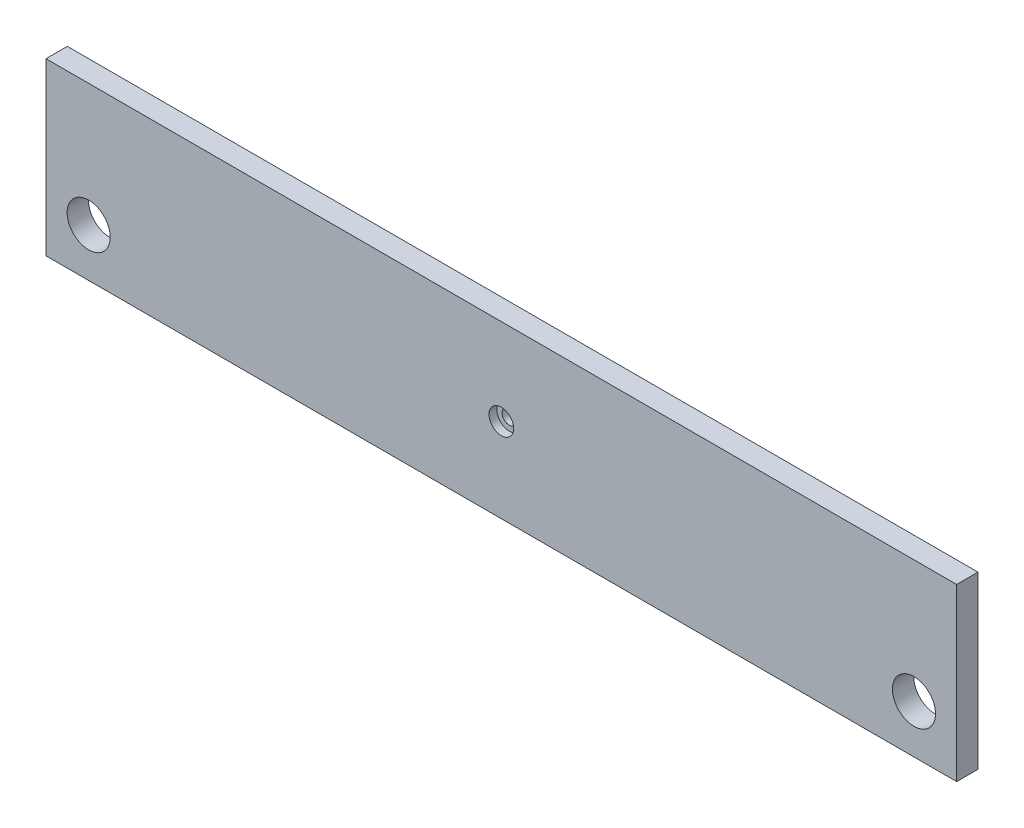
ISO-10303-21;
HEADER;
FILE_DESCRIPTION(('STEP AP214'),'2;1');
FILE_NAME('part.step','',(''),(''),'','','');
FILE_SCHEMA(('AUTOMOTIVE_DESIGN { 1 0 10303 214 1 1 1 1 }'));
ENDSEC;
DATA;
#1=APPLICATION_CONTEXT('core data for automotive mechanical design processes');
#2=APPLICATION_PROTOCOL_DEFINITION('international standard','automotive_design',2000,#1);
#3=PRODUCT_CONTEXT('',#1,'mechanical');
#4=PRODUCT('Part','Part','',(#3));
#5=PRODUCT_RELATED_PRODUCT_CATEGORY('part','',(#4));
#6=PRODUCT_DEFINITION_FORMATION('','',#4);
#7=PRODUCT_DEFINITION_CONTEXT('part definition',#1,'design');
#8=PRODUCT_DEFINITION('design','',#6,#7);
#9=PRODUCT_DEFINITION_SHAPE('','',#8);
#10=(LENGTH_UNIT() NAMED_UNIT(*) SI_UNIT(.MILLI.,.METRE.));
#11=(NAMED_UNIT(*) PLANE_ANGLE_UNIT() SI_UNIT($,.RADIAN.));
#12=(NAMED_UNIT(*) SI_UNIT($,.STERADIAN.) SOLID_ANGLE_UNIT());
#13=UNCERTAINTY_MEASURE_WITH_UNIT(LENGTH_MEASURE(1.E-05),#10,'distance_accuracy_value','');
#14=(GEOMETRIC_REPRESENTATION_CONTEXT(3) GLOBAL_UNCERTAINTY_ASSIGNED_CONTEXT((#13)) GLOBAL_UNIT_ASSIGNED_CONTEXT((#10,
#11,#12)) REPRESENTATION_CONTEXT('',''));
#15=CARTESIAN_POINT('',(0.,0.,0.));
#16=DIRECTION('',(0.,0.,1.));
#17=DIRECTION('',(1.,0.,0.));
#18=AXIS2_PLACEMENT_3D('',#15,#16,#17);
#19=CARTESIAN_POINT('',(0.,0.,19.05));
#20=DIRECTION('',(1.,0.,0.));
#21=DIRECTION('',(0.,0.,-1.));
#22=AXIS2_PLACEMENT_3D('',#19,#20,#21);
#23=PLANE('',#22);
#24=DIRECTION('',(0.,-1.,0.));
#25=VECTOR('',#24,1.);
#26=CARTESIAN_POINT('',(0.,0.,0.));
#27=LINE('',#26,#25);
#28=CARTESIAN_POINT('',(0.,152.4,0.));
#29=VERTEX_POINT('',#28);
#30=CARTESIAN_POINT('',(0.,0.,0.));
#31=VERTEX_POINT('',#30);
#32=EDGE_CURVE('E95',#29,#31,#27,.T.);
#33=ORIENTED_EDGE('',*,*,#32,.T.);
#34=DIRECTION('',(0.,0.,-1.));
#35=VECTOR('',#34,1.);
#36=CARTESIAN_POINT('',(0.,0.,19.05));
#37=LINE('',#36,#35);
#38=CARTESIAN_POINT('',(0.,0.,19.05));
#39=VERTEX_POINT('',#38);
#40=EDGE_CURVE('E11',#39,#31,#37,.T.);
#41=ORIENTED_EDGE('',*,*,#40,.F.);
#42=DIRECTION('',(0.,-1.,0.));
#43=VECTOR('',#42,1.);
#44=CARTESIAN_POINT('',(0.,0.,19.05));
#45=LINE('',#44,#43);
#46=CARTESIAN_POINT('',(0.,152.4,19.05));
#47=VERTEX_POINT('',#46);
#48=EDGE_CURVE('E83',#47,#39,#45,.T.);
#49=ORIENTED_EDGE('',*,*,#48,.F.);
#50=DIRECTION('',(0.,0.,-1.));
#51=VECTOR('',#50,1.);
#52=CARTESIAN_POINT('',(0.,152.4,19.05));
#53=LINE('',#52,#51);
#54=EDGE_CURVE('E91',#47,#29,#53,.T.);
#55=ORIENTED_EDGE('',*,*,#54,.T.);
#56=EDGE_LOOP('',(#33,#41,#49,#55));
#57=FACE_BOUND('',#56,.T.);
#58=ADVANCED_FACE('F32',(#57),#23,.F.);
#59=CARTESIAN_POINT('',(0.,0.,19.05));
#60=DIRECTION('',(0.,1.,0.));
#61=DIRECTION('',(0.,0.,1.));
#62=AXIS2_PLACEMENT_3D('',#59,#60,#61);
#63=PLANE('',#62);
#64=DIRECTION('',(1.,0.,0.));
#65=VECTOR('',#64,1.);
#66=CARTESIAN_POINT('',(0.,0.,0.));
#67=LINE('',#66,#65);
#68=CARTESIAN_POINT('',(812.8,0.,0.));
#69=VERTEX_POINT('',#68);
#70=EDGE_CURVE('E87',#31,#69,#67,.T.);
#71=ORIENTED_EDGE('',*,*,#70,.T.);
#72=DIRECTION('',(0.,0.,-1.));
#73=VECTOR('',#72,1.);
#74=CARTESIAN_POINT('',(812.8,0.,19.05));
#75=LINE('',#74,#73);
#76=CARTESIAN_POINT('',(812.8,0.,19.05));
#77=VERTEX_POINT('',#76);
#78=EDGE_CURVE('E40',#77,#69,#75,.T.);
#79=ORIENTED_EDGE('',*,*,#78,.F.);
#80=DIRECTION('',(1.,0.,0.));
#81=VECTOR('',#80,1.);
#82=CARTESIAN_POINT('',(0.,0.,19.05));
#83=LINE('',#82,#81);
#84=EDGE_CURVE('E78',#39,#77,#83,.T.);
#85=ORIENTED_EDGE('',*,*,#84,.F.);
#86=ORIENTED_EDGE('',*,*,#40,.T.);
#87=EDGE_LOOP('',(#71,#79,#85,#86));
#88=FACE_BOUND('',#87,.T.);
#89=ADVANCED_FACE('F86',(#88),#63,.F.);
#90=CARTESIAN_POINT('',(812.8,0.,19.05));
#91=DIRECTION('',(-1.,0.,0.));
#92=DIRECTION('',(0.,0.,1.));
#93=AXIS2_PLACEMENT_3D('',#90,#91,#92);
#94=PLANE('',#93);
#95=DIRECTION('',(0.,1.,0.));
#96=VECTOR('',#95,1.);
#97=CARTESIAN_POINT('',(812.8,0.,0.));
#98=LINE('',#97,#96);
#99=CARTESIAN_POINT('',(812.8,152.4,0.));
#100=VERTEX_POINT('',#99);
#101=EDGE_CURVE('E65',#69,#100,#98,.T.);
#102=ORIENTED_EDGE('',*,*,#101,.T.);
#103=DIRECTION('',(0.,0.,-1.));
#104=VECTOR('',#103,1.);
#105=CARTESIAN_POINT('',(812.8,152.4,19.05));
#106=LINE('',#105,#104);
#107=CARTESIAN_POINT('',(812.8,152.4,19.05));
#108=VERTEX_POINT('',#107);
#109=EDGE_CURVE('E88',#108,#100,#106,.T.);
#110=ORIENTED_EDGE('',*,*,#109,.F.);
#111=DIRECTION('',(0.,1.,0.));
#112=VECTOR('',#111,1.);
#113=CARTESIAN_POINT('',(812.8,0.,19.05));
#114=LINE('',#113,#112);
#115=EDGE_CURVE('E81',#77,#108,#114,.T.);
#116=ORIENTED_EDGE('',*,*,#115,.F.);
#117=ORIENTED_EDGE('',*,*,#78,.T.);
#118=EDGE_LOOP('',(#102,#110,#116,#117));
#119=FACE_BOUND('',#118,.T.);
#120=ADVANCED_FACE('F89',(#119),#94,.F.);
#121=CARTESIAN_POINT('',(0.,152.4,19.05));
#122=DIRECTION('',(0.,-1.,0.));
#123=DIRECTION('',(0.,0.,-1.));
#124=AXIS2_PLACEMENT_3D('',#121,#122,#123);
#125=PLANE('',#124);
#126=DIRECTION('',(-1.,0.,0.));
#127=VECTOR('',#126,1.);
#128=CARTESIAN_POINT('',(0.,152.4,0.));
#129=LINE('',#128,#127);
#130=EDGE_CURVE('E71',#100,#29,#129,.T.);
#131=ORIENTED_EDGE('',*,*,#130,.T.);
#132=ORIENTED_EDGE('',*,*,#54,.F.);
#133=DIRECTION('',(-1.,0.,0.));
#134=VECTOR('',#133,1.);
#135=CARTESIAN_POINT('',(0.,152.4,19.05));
#136=LINE('',#135,#134);
#137=EDGE_CURVE('E48',#108,#47,#136,.T.);
#138=ORIENTED_EDGE('',*,*,#137,.F.);
#139=ORIENTED_EDGE('',*,*,#109,.T.);
#140=EDGE_LOOP('',(#131,#132,#138,#139));
#141=FACE_BOUND('',#140,.T.);
#142=ADVANCED_FACE('F103',(#141),#125,.F.);
#143=CARTESIAN_POINT('',(0.,152.4,19.05));
#144=DIRECTION('',(0.,0.,-1.));
#145=DIRECTION('',(-1.,0.,0.));
#146=AXIS2_PLACEMENT_3D('',#143,#144,#145);
#147=PLANE('',#146);
#148=CARTESIAN_POINT('',(406.4,75.2094,19.05));
#149=DIRECTION('',(0.,0.,1.));
#150=DIRECTION('',(1.,0.,0.));
#151=AXIS2_PLACEMENT_3D('',#148,#149,#150);
#152=CIRCLE('',#151,10.9982);
#153=CARTESIAN_POINT('',(417.3982,75.2094,19.05));
#154=VERTEX_POINT('',#153);
#155=EDGE_CURVE('E121',#154,#154,#152,.T.);
#156=ORIENTED_EDGE('',*,*,#155,.F.);
#157=EDGE_LOOP('',(#156));
#158=FACE_BOUND('',#157,.T.);
#159=CARTESIAN_POINT('',(774.7,42.926,19.05));
#160=DIRECTION('',(0.,0.,1.));
#161=DIRECTION('',(1.,0.,0.));
#162=AXIS2_PLACEMENT_3D('',#159,#160,#161);
#163=CIRCLE('',#162,19.2405);
#164=CARTESIAN_POINT('',(793.9405,42.926,19.05));
#165=VERTEX_POINT('',#164);
#166=EDGE_CURVE('E115',#165,#165,#163,.T.);
#167=ORIENTED_EDGE('',*,*,#166,.F.);
#168=EDGE_LOOP('',(#167));
#169=FACE_BOUND('',#168,.T.);
#170=CARTESIAN_POINT('',(38.1,42.926,19.05));
#171=DIRECTION('',(0.,0.,1.));
#172=DIRECTION('',(1.,0.,0.));
#173=AXIS2_PLACEMENT_3D('',#170,#171,#172);
#174=CIRCLE('',#173,19.2405);
#175=CARTESIAN_POINT('',(57.3405,42.926,19.05));
#176=VERTEX_POINT('',#175);
#177=EDGE_CURVE('E109',#176,#176,#174,.T.);
#178=ORIENTED_EDGE('',*,*,#177,.F.);
#179=EDGE_LOOP('',(#178));
#180=FACE_BOUND('',#179,.T.);
#181=ORIENTED_EDGE('',*,*,#48,.T.);
#182=ORIENTED_EDGE('',*,*,#84,.T.);
#183=ORIENTED_EDGE('',*,*,#115,.T.);
#184=ORIENTED_EDGE('',*,*,#137,.T.);
#185=EDGE_LOOP('',(#181,#182,#183,#184));
#186=FACE_BOUND('',#185,.T.);
#187=ADVANCED_FACE('F79',(#158,#169,#180,#186),#147,.F.);
#188=CARTESIAN_POINT('',(0.,152.4,0.));
#189=DIRECTION('',(0.,0.,-1.));
#190=DIRECTION('',(-1.,0.,0.));
#191=AXIS2_PLACEMENT_3D('',#188,#189,#190);
#192=PLANE('',#191);
#193=CARTESIAN_POINT('',(406.4,75.2094,0.));
#194=DIRECTION('',(0.,0.,1.));
#195=DIRECTION('',(1.,0.,0.));
#196=AXIS2_PLACEMENT_3D('',#193,#194,#195);
#197=CIRCLE('',#196,6.35);
#198=CARTESIAN_POINT('',(412.75,75.2094,0.));
#199=VERTEX_POINT('',#198);
#200=EDGE_CURVE('E124',#199,#199,#197,.T.);
#201=ORIENTED_EDGE('',*,*,#200,.T.);
#202=EDGE_LOOP('',(#201));
#203=FACE_BOUND('',#202,.T.);
#204=CARTESIAN_POINT('',(774.7,42.926,0.));
#205=DIRECTION('',(0.,0.,1.));
#206=DIRECTION('',(1.,0.,0.));
#207=AXIS2_PLACEMENT_3D('',#204,#205,#206);
#208=CIRCLE('',#207,19.2405);
#209=CARTESIAN_POINT('',(793.9405,42.926,0.));
#210=VERTEX_POINT('',#209);
#211=EDGE_CURVE('E112',#210,#210,#208,.T.);
#212=ORIENTED_EDGE('',*,*,#211,.T.);
#213=EDGE_LOOP('',(#212));
#214=FACE_BOUND('',#213,.T.);
#215=CARTESIAN_POINT('',(38.1,42.926,0.));
#216=DIRECTION('',(0.,0.,1.));
#217=DIRECTION('',(1.,0.,0.));
#218=AXIS2_PLACEMENT_3D('',#215,#216,#217);
#219=CIRCLE('',#218,19.2405);
#220=CARTESIAN_POINT('',(57.3405,42.926,0.));
#221=VERTEX_POINT('',#220);
#222=EDGE_CURVE('E98',#221,#221,#219,.T.);
#223=ORIENTED_EDGE('',*,*,#222,.T.);
#224=EDGE_LOOP('',(#223));
#225=FACE_BOUND('',#224,.T.);
#226=ORIENTED_EDGE('',*,*,#32,.F.);
#227=ORIENTED_EDGE('',*,*,#130,.F.);
#228=ORIENTED_EDGE('',*,*,#101,.F.);
#229=ORIENTED_EDGE('',*,*,#70,.F.);
#230=EDGE_LOOP('',(#226,#227,#228,#229));
#231=FACE_BOUND('',#230,.T.);
#232=ADVANCED_FACE('F106',(#203,#214,#225,#231),#192,.T.);
#233=CARTESIAN_POINT('',(38.1,42.926,0.));
#234=DIRECTION('',(0.,0.,1.));
#235=DIRECTION('',(1.,0.,0.));
#236=AXIS2_PLACEMENT_3D('',#233,#234,#235);
#237=CYLINDRICAL_SURFACE('',#236,19.2405);
#238=CARTESIAN_POINT('',(57.3405,42.926,0.));
#239=CARTESIAN_POINT('',(57.3405,42.926,0.1984375));
#240=CARTESIAN_POINT('',(57.3405,42.926,0.396875));
#241=CARTESIAN_POINT('',(57.3405,42.926,0.79375));
#242=CARTESIAN_POINT('',(57.3405,42.926,0.9921875));
#243=CARTESIAN_POINT('',(57.3405,42.926,1.3890625));
#244=CARTESIAN_POINT('',(57.3405,42.926,1.5875));
#245=CARTESIAN_POINT('',(57.3405,42.926,1.984375));
#246=CARTESIAN_POINT('',(57.3405,42.926,2.1828125));
#247=CARTESIAN_POINT('',(57.3405,42.926,2.5796875));
#248=CARTESIAN_POINT('',(57.3405,42.926,2.778125));
#249=CARTESIAN_POINT('',(57.3405,42.926,3.175));
#250=CARTESIAN_POINT('',(57.3405,42.926,3.3734375));
#251=CARTESIAN_POINT('',(57.3405,42.926,3.7703125));
#252=CARTESIAN_POINT('',(57.3405,42.926,3.96875));
#253=CARTESIAN_POINT('',(57.3405,42.926,4.365625));
#254=CARTESIAN_POINT('',(57.3405,42.926,4.5640625));
#255=CARTESIAN_POINT('',(57.3405,42.926,4.9609375));
#256=CARTESIAN_POINT('',(57.3405,42.926,5.159375));
#257=CARTESIAN_POINT('',(57.3405,42.926,5.55625));
#258=CARTESIAN_POINT('',(57.3405,42.926,5.7546875));
#259=CARTESIAN_POINT('',(57.3405,42.926,6.1515625));
#260=CARTESIAN_POINT('',(57.3405,42.926,6.35));
#261=CARTESIAN_POINT('',(57.3405,42.926,6.746875));
#262=CARTESIAN_POINT('',(57.3405,42.926,6.9453125));
#263=CARTESIAN_POINT('',(57.3405,42.926,7.3421875));
#264=CARTESIAN_POINT('',(57.3405,42.926,7.540625));
#265=CARTESIAN_POINT('',(57.3405,42.926,7.9375));
#266=CARTESIAN_POINT('',(57.3405,42.926,8.1359375));
#267=CARTESIAN_POINT('',(57.3405,42.926,8.5328125));
#268=CARTESIAN_POINT('',(57.3405,42.926,8.73125));
#269=CARTESIAN_POINT('',(57.3405,42.926,9.128125));
#270=CARTESIAN_POINT('',(57.3405,42.926,9.3265625));
#271=CARTESIAN_POINT('',(57.3405,42.926,9.7234375));
#272=CARTESIAN_POINT('',(57.3405,42.926,9.921875));
#273=CARTESIAN_POINT('',(57.3405,42.926,10.31875));
#274=CARTESIAN_POINT('',(57.3405,42.926,10.5171875));
#275=CARTESIAN_POINT('',(57.3405,42.926,10.9140625));
#276=CARTESIAN_POINT('',(57.3405,42.926,11.1125));
#277=CARTESIAN_POINT('',(57.3405,42.926,11.509375));
#278=CARTESIAN_POINT('',(57.3405,42.926,11.7078125));
#279=CARTESIAN_POINT('',(57.3405,42.926,12.1046875));
#280=CARTESIAN_POINT('',(57.3405,42.926,12.303125));
#281=CARTESIAN_POINT('',(57.3405,42.926,12.7));
#282=CARTESIAN_POINT('',(57.3405,42.926,12.8984375));
#283=CARTESIAN_POINT('',(57.3405,42.926,13.2953125));
#284=CARTESIAN_POINT('',(57.3405,42.926,13.49375));
#285=CARTESIAN_POINT('',(57.3405,42.926,13.890625));
#286=CARTESIAN_POINT('',(57.3405,42.926,14.0890625));
#287=CARTESIAN_POINT('',(57.3405,42.926,14.4859375));
#288=CARTESIAN_POINT('',(57.3405,42.926,14.684375));
#289=CARTESIAN_POINT('',(57.3405,42.926,15.08125));
#290=CARTESIAN_POINT('',(57.3405,42.926,15.2796875));
#291=CARTESIAN_POINT('',(57.3405,42.926,15.6765625));
#292=CARTESIAN_POINT('',(57.3405,42.926,15.875));
#293=CARTESIAN_POINT('',(57.3405,42.926,16.271875));
#294=CARTESIAN_POINT('',(57.3405,42.926,16.4703125));
#295=CARTESIAN_POINT('',(57.3405,42.926,16.8671875));
#296=CARTESIAN_POINT('',(57.3405,42.926,17.065625));
#297=CARTESIAN_POINT('',(57.3405,42.926,17.4625));
#298=CARTESIAN_POINT('',(57.3405,42.926,17.6609375));
#299=CARTESIAN_POINT('',(57.3405,42.926,18.0578125));
#300=CARTESIAN_POINT('',(57.3405,42.926,18.25625));
#301=CARTESIAN_POINT('',(57.3405,42.926,18.653125));
#302=CARTESIAN_POINT('',(57.3405,42.926,18.8515625));
#303=CARTESIAN_POINT('',(57.3405,42.926,19.05));
#304=B_SPLINE_CURVE_WITH_KNOTS('',3,(#238,#239,#240,#241,#242,#243,#244,#245,#246,#247,#248,
#249,#250,#251,#252,#253,#254,#255,#256,#257,#258,#259,#260,#261,#262,#263,#264,#265,#266,#267,
#268,#269,#270,#271,#272,#273,#274,#275,#276,#277,#278,#279,#280,#281,#282,#283,#284,#285,#286,
#287,#288,#289,#290,#291,#292,#293,#294,#295,#296,#297,#298,#299,#300,#301,#302,#303),
.UNSPECIFIED.,.F.,.F.,(4,2,2,2,2,2,2,2,2,2,2,2,2,2,2,2,2,2,2,2,2,2,2,2,2,2,2,2,2,2,2,2,4),(0.,
0.5953125,1.190625,1.7859375,2.38125,2.9765625,3.571875,4.1671875,4.7625,5.3578125,5.953125,
6.5484375,7.14375,7.7390625,8.334375,8.9296875,9.525,10.1203125,10.715625,11.3109375,11.90625,
12.5015625,13.096875,13.6921875,14.2875,14.8828125,15.478125,16.0734375,16.66875,17.2640625,
17.859375,18.4546875,19.05),.UNSPECIFIED.);
#305=EDGE_CURVE('BSEAM161',#221,#176,#304,.T.);
#306=ORIENTED_EDGE('',*,*,#222,.F.);
#307=ORIENTED_EDGE('',*,*,#177,.T.);
#308=ORIENTED_EDGE('',*,*,#305,.T.);
#309=ORIENTED_EDGE('',*,*,#305,.F.);
#310=EDGE_LOOP('',(#306,#308,#307,#309));
#311=FACE_BOUND('',#310,.T.);
#312=ADVANCED_FACE('F161',(#311),#237,.F.);
#313=CARTESIAN_POINT('',(774.7,42.926,0.));
#314=DIRECTION('',(0.,0.,1.));
#315=DIRECTION('',(1.,0.,0.));
#316=AXIS2_PLACEMENT_3D('',#313,#314,#315);
#317=CYLINDRICAL_SURFACE('',#316,19.2405);
#318=CARTESIAN_POINT('',(793.9405,42.926,0.));
#319=CARTESIAN_POINT('',(793.9405,42.926,0.1984375));
#320=CARTESIAN_POINT('',(793.9405,42.926,0.396875));
#321=CARTESIAN_POINT('',(793.9405,42.926,0.79375));
#322=CARTESIAN_POINT('',(793.9405,42.926,0.9921875));
#323=CARTESIAN_POINT('',(793.9405,42.926,1.3890625));
#324=CARTESIAN_POINT('',(793.9405,42.926,1.5875));
#325=CARTESIAN_POINT('',(793.9405,42.926,1.984375));
#326=CARTESIAN_POINT('',(793.9405,42.926,2.1828125));
#327=CARTESIAN_POINT('',(793.9405,42.926,2.5796875));
#328=CARTESIAN_POINT('',(793.9405,42.926,2.778125));
#329=CARTESIAN_POINT('',(793.9405,42.926,3.175));
#330=CARTESIAN_POINT('',(793.9405,42.926,3.3734375));
#331=CARTESIAN_POINT('',(793.9405,42.926,3.7703125));
#332=CARTESIAN_POINT('',(793.9405,42.926,3.96875));
#333=CARTESIAN_POINT('',(793.9405,42.926,4.365625));
#334=CARTESIAN_POINT('',(793.9405,42.926,4.5640625));
#335=CARTESIAN_POINT('',(793.9405,42.926,4.9609375));
#336=CARTESIAN_POINT('',(793.9405,42.926,5.159375));
#337=CARTESIAN_POINT('',(793.9405,42.926,5.55625));
#338=CARTESIAN_POINT('',(793.9405,42.926,5.7546875));
#339=CARTESIAN_POINT('',(793.9405,42.926,6.1515625));
#340=CARTESIAN_POINT('',(793.9405,42.926,6.35));
#341=CARTESIAN_POINT('',(793.9405,42.926,6.746875));
#342=CARTESIAN_POINT('',(793.9405,42.926,6.9453125));
#343=CARTESIAN_POINT('',(793.9405,42.926,7.3421875));
#344=CARTESIAN_POINT('',(793.9405,42.926,7.540625));
#345=CARTESIAN_POINT('',(793.9405,42.926,7.9375));
#346=CARTESIAN_POINT('',(793.9405,42.926,8.1359375));
#347=CARTESIAN_POINT('',(793.9405,42.926,8.5328125));
#348=CARTESIAN_POINT('',(793.9405,42.926,8.73125));
#349=CARTESIAN_POINT('',(793.9405,42.926,9.128125));
#350=CARTESIAN_POINT('',(793.9405,42.926,9.3265625));
#351=CARTESIAN_POINT('',(793.9405,42.926,9.7234375));
#352=CARTESIAN_POINT('',(793.9405,42.926,9.921875));
#353=CARTESIAN_POINT('',(793.9405,42.926,10.31875));
#354=CARTESIAN_POINT('',(793.9405,42.926,10.5171875));
#355=CARTESIAN_POINT('',(793.9405,42.926,10.9140625));
#356=CARTESIAN_POINT('',(793.9405,42.926,11.1125));
#357=CARTESIAN_POINT('',(793.9405,42.926,11.509375));
#358=CARTESIAN_POINT('',(793.9405,42.926,11.7078125));
#359=CARTESIAN_POINT('',(793.9405,42.926,12.1046875));
#360=CARTESIAN_POINT('',(793.9405,42.926,12.303125));
#361=CARTESIAN_POINT('',(793.9405,42.926,12.7));
#362=CARTESIAN_POINT('',(793.9405,42.926,12.8984375));
#363=CARTESIAN_POINT('',(793.9405,42.926,13.2953125));
#364=CARTESIAN_POINT('',(793.9405,42.926,13.49375));
#365=CARTESIAN_POINT('',(793.9405,42.926,13.890625));
#366=CARTESIAN_POINT('',(793.9405,42.926,14.0890625));
#367=CARTESIAN_POINT('',(793.9405,42.926,14.4859375));
#368=CARTESIAN_POINT('',(793.9405,42.926,14.684375));
#369=CARTESIAN_POINT('',(793.9405,42.926,15.08125));
#370=CARTESIAN_POINT('',(793.9405,42.926,15.2796875));
#371=CARTESIAN_POINT('',(793.9405,42.926,15.6765625));
#372=CARTESIAN_POINT('',(793.9405,42.926,15.875));
#373=CARTESIAN_POINT('',(793.9405,42.926,16.271875));
#374=CARTESIAN_POINT('',(793.9405,42.926,16.4703125));
#375=CARTESIAN_POINT('',(793.9405,42.926,16.8671875));
#376=CARTESIAN_POINT('',(793.9405,42.926,17.065625));
#377=CARTESIAN_POINT('',(793.9405,42.926,17.4625));
#378=CARTESIAN_POINT('',(793.9405,42.926,17.6609375));
#379=CARTESIAN_POINT('',(793.9405,42.926,18.0578125));
#380=CARTESIAN_POINT('',(793.9405,42.926,18.25625));
#381=CARTESIAN_POINT('',(793.9405,42.926,18.653125));
#382=CARTESIAN_POINT('',(793.9405,42.926,18.8515625));
#383=CARTESIAN_POINT('',(793.9405,42.926,19.05));
#384=B_SPLINE_CURVE_WITH_KNOTS('',3,(#318,#319,#320,#321,#322,#323,#324,#325,#326,#327,#328,
#329,#330,#331,#332,#333,#334,#335,#336,#337,#338,#339,#340,#341,#342,#343,#344,#345,#346,#347,
#348,#349,#350,#351,#352,#353,#354,#355,#356,#357,#358,#359,#360,#361,#362,#363,#364,#365,#366,
#367,#368,#369,#370,#371,#372,#373,#374,#375,#376,#377,#378,#379,#380,#381,#382,#383),
.UNSPECIFIED.,.F.,.F.,(4,2,2,2,2,2,2,2,2,2,2,2,2,2,2,2,2,2,2,2,2,2,2,2,2,2,2,2,2,2,2,2,4),(0.,
0.5953125,1.190625,1.7859375,2.38125,2.9765625,3.571875,4.1671875,4.7625,5.3578125,5.953125,
6.5484375,7.14375,7.7390625,8.334375,8.9296875,9.525,10.1203125,10.715625,11.3109375,11.90625,
12.5015625,13.096875,13.6921875,14.2875,14.8828125,15.478125,16.0734375,16.66875,17.2640625,
17.859375,18.4546875,19.05),.UNSPECIFIED.);
#385=EDGE_CURVE('BSEAM150',#210,#165,#384,.T.);
#386=ORIENTED_EDGE('',*,*,#211,.F.);
#387=ORIENTED_EDGE('',*,*,#166,.T.);
#388=ORIENTED_EDGE('',*,*,#385,.T.);
#389=ORIENTED_EDGE('',*,*,#385,.F.);
#390=EDGE_LOOP('',(#386,#388,#387,#389));
#391=FACE_BOUND('',#390,.T.);
#392=ADVANCED_FACE('F150',(#391),#317,.F.);
#393=CARTESIAN_POINT('',(406.4,75.2094,12.065));
#394=DIRECTION('',(0.,0.,1.));
#395=DIRECTION('',(1.,0.,0.));
#396=AXIS2_PLACEMENT_3D('',#393,#394,#395);
#397=CYLINDRICAL_SURFACE('',#396,10.9982);
#398=CARTESIAN_POINT('',(406.4,75.2094,12.065));
#399=DIRECTION('',(0.,0.,1.));
#400=DIRECTION('',(1.,0.,0.));
#401=AXIS2_PLACEMENT_3D('',#398,#399,#400);
#402=CIRCLE('',#401,10.9982);
#403=CARTESIAN_POINT('',(417.3982,75.2094,12.065));
#404=VERTEX_POINT('',#403);
#405=EDGE_CURVE('E118',#404,#404,#402,.T.);
#406=ORIENTED_EDGE('',*,*,#405,.F.);
#407=EDGE_LOOP('',(#406));
#408=FACE_BOUND('',#407,.T.);
#409=ORIENTED_EDGE('',*,*,#155,.T.);
#410=EDGE_LOOP('',(#409));
#411=FACE_BOUND('',#410,.T.);
#412=ADVANCED_FACE('F144',(#408,#411),#397,.F.);
#413=CARTESIAN_POINT('',(406.4,75.2094,12.065));
#414=DIRECTION('',(0.,0.,1.));
#415=DIRECTION('',(1.,0.,0.));
#416=AXIS2_PLACEMENT_3D('',#413,#414,#415);
#417=PLANE('',#416);
#418=CARTESIAN_POINT('',(406.4,75.2094,12.065));
#419=DIRECTION('',(0.,0.,1.));
#420=DIRECTION('',(1.,0.,0.));
#421=AXIS2_PLACEMENT_3D('',#418,#419,#420);
#422=CIRCLE('',#421,6.35);
#423=CARTESIAN_POINT('',(412.75,75.2094,12.065));
#424=VERTEX_POINT('',#423);
#425=EDGE_CURVE('E127',#424,#424,#422,.T.);
#426=ORIENTED_EDGE('',*,*,#425,.F.);
#427=EDGE_LOOP('',(#426));
#428=FACE_BOUND('',#427,.T.);
#429=ORIENTED_EDGE('',*,*,#405,.T.);
#430=EDGE_LOOP('',(#429));
#431=FACE_BOUND('',#430,.T.);
#432=ADVANCED_FACE('F138',(#428,#431),#417,.T.);
#433=CARTESIAN_POINT('',(406.4,75.2094,0.));
#434=DIRECTION('',(0.,0.,1.));
#435=DIRECTION('',(1.,0.,0.));
#436=AXIS2_PLACEMENT_3D('',#433,#434,#435);
#437=CYLINDRICAL_SURFACE('',#436,6.35);
#438=CARTESIAN_POINT('',(412.75,75.2094,0.));
#439=CARTESIAN_POINT('',(412.75,75.2094,0.125677083333333));
#440=CARTESIAN_POINT('',(412.75,75.2094,0.251354166666667));
#441=CARTESIAN_POINT('',(412.75,75.2094,0.502708333333333));
#442=CARTESIAN_POINT('',(412.75,75.2094,0.628385416666666));
#443=CARTESIAN_POINT('',(412.75,75.2094,0.879739583333333));
#444=CARTESIAN_POINT('',(412.75,75.2094,1.00541666666667));
#445=CARTESIAN_POINT('',(412.75,75.2094,1.25677083333333));
#446=CARTESIAN_POINT('',(412.75,75.2094,1.38244791666667));
#447=CARTESIAN_POINT('',(412.75,75.2094,1.63380208333333));
#448=CARTESIAN_POINT('',(412.75,75.2094,1.75947916666667));
#449=CARTESIAN_POINT('',(412.75,75.2094,2.01083333333333));
#450=CARTESIAN_POINT('',(412.75,75.2094,2.13651041666667));
#451=CARTESIAN_POINT('',(412.75,75.2094,2.38786458333333));
#452=CARTESIAN_POINT('',(412.75,75.2094,2.51354166666667));
#453=CARTESIAN_POINT('',(412.75,75.2094,2.76489583333333));
#454=CARTESIAN_POINT('',(412.75,75.2094,2.89057291666667));
#455=CARTESIAN_POINT('',(412.75,75.2094,3.14192708333333));
#456=CARTESIAN_POINT('',(412.75,75.2094,3.26760416666667));
#457=CARTESIAN_POINT('',(412.75,75.2094,3.51895833333333));
#458=CARTESIAN_POINT('',(412.75,75.2094,3.64463541666667));
#459=CARTESIAN_POINT('',(412.75,75.2094,3.89598958333333));
#460=CARTESIAN_POINT('',(412.75,75.2094,4.02166666666667));
#461=CARTESIAN_POINT('',(412.75,75.2094,4.27302083333333));
#462=CARTESIAN_POINT('',(412.75,75.2094,4.39869791666667));
#463=CARTESIAN_POINT('',(412.75,75.2094,4.65005208333333));
#464=CARTESIAN_POINT('',(412.75,75.2094,4.77572916666667));
#465=CARTESIAN_POINT('',(412.75,75.2094,5.02708333333333));
#466=CARTESIAN_POINT('',(412.75,75.2094,5.15276041666667));
#467=CARTESIAN_POINT('',(412.75,75.2094,5.40411458333333));
#468=CARTESIAN_POINT('',(412.75,75.2094,5.52979166666667));
#469=CARTESIAN_POINT('',(412.75,75.2094,5.78114583333333));
#470=CARTESIAN_POINT('',(412.75,75.2094,5.90682291666667));
#471=CARTESIAN_POINT('',(412.75,75.2094,6.15817708333333));
#472=CARTESIAN_POINT('',(412.75,75.2094,6.28385416666667));
#473=CARTESIAN_POINT('',(412.75,75.2094,6.53520833333333));
#474=CARTESIAN_POINT('',(412.75,75.2094,6.66088541666667));
#475=CARTESIAN_POINT('',(412.75,75.2094,6.91223958333333));
#476=CARTESIAN_POINT('',(412.75,75.2094,7.03791666666667));
#477=CARTESIAN_POINT('',(412.75,75.2094,7.28927083333333));
#478=CARTESIAN_POINT('',(412.75,75.2094,7.41494791666666));
#479=CARTESIAN_POINT('',(412.75,75.2094,7.66630208333333));
#480=CARTESIAN_POINT('',(412.75,75.2094,7.79197916666666));
#481=CARTESIAN_POINT('',(412.75,75.2094,8.04333333333333));
#482=CARTESIAN_POINT('',(412.75,75.2094,8.16901041666667));
#483=CARTESIAN_POINT('',(412.75,75.2094,8.42036458333333));
#484=CARTESIAN_POINT('',(412.75,75.2094,8.54604166666667));
#485=CARTESIAN_POINT('',(412.75,75.2094,8.79739583333333));
#486=CARTESIAN_POINT('',(412.75,75.2094,8.92307291666667));
#487=CARTESIAN_POINT('',(412.75,75.2094,9.17442708333333));
#488=CARTESIAN_POINT('',(412.75,75.2094,9.30010416666667));
#489=CARTESIAN_POINT('',(412.75,75.2094,9.55145833333333));
#490=CARTESIAN_POINT('',(412.75,75.2094,9.67713541666667));
#491=CARTESIAN_POINT('',(412.75,75.2094,9.92848958333333));
#492=CARTESIAN_POINT('',(412.75,75.2094,10.0541666666667));
#493=CARTESIAN_POINT('',(412.75,75.2094,10.3055208333333));
#494=CARTESIAN_POINT('',(412.75,75.2094,10.4311979166667));
#495=CARTESIAN_POINT('',(412.75,75.2094,10.6825520833333));
#496=CARTESIAN_POINT('',(412.75,75.2094,10.8082291666667));
#497=CARTESIAN_POINT('',(412.75,75.2094,11.0595833333333));
#498=CARTESIAN_POINT('',(412.75,75.2094,11.1852604166667));
#499=CARTESIAN_POINT('',(412.75,75.2094,11.4366145833333));
#500=CARTESIAN_POINT('',(412.75,75.2094,11.5622916666667));
#501=CARTESIAN_POINT('',(412.75,75.2094,11.8136458333333));
#502=CARTESIAN_POINT('',(412.75,75.2094,11.9393229166667));
#503=CARTESIAN_POINT('',(412.75,75.2094,12.065));
#504=B_SPLINE_CURVE_WITH_KNOTS('',3,(#438,#439,#440,#441,#442,#443,#444,#445,#446,#447,#448,
#449,#450,#451,#452,#453,#454,#455,#456,#457,#458,#459,#460,#461,#462,#463,#464,#465,#466,#467,
#468,#469,#470,#471,#472,#473,#474,#475,#476,#477,#478,#479,#480,#481,#482,#483,#484,#485,#486,
#487,#488,#489,#490,#491,#492,#493,#494,#495,#496,#497,#498,#499,#500,#501,#502,#503),
.UNSPECIFIED.,.F.,.F.,(4,2,2,2,2,2,2,2,2,2,2,2,2,2,2,2,2,2,2,2,2,2,2,2,2,2,2,2,2,2,2,2,4),(0.,
0.37703125,0.7540625,1.13109375,1.508125,1.88515625,2.2621875,2.63921875,3.01625,3.39328125,
3.7703125,4.14734375,4.524375,4.90140625,5.2784375,5.65546875,6.0325,6.40953125,6.7865625,
7.16359375,7.540625,7.91765625,8.2946875,8.67171875,9.04875,9.42578125,9.8028125,10.17984375,
10.556875,10.93390625,11.3109375,11.68796875,12.065),.UNSPECIFIED.);
#505=EDGE_CURVE('BSEAM135',#199,#424,#504,.T.);
#506=ORIENTED_EDGE('',*,*,#200,.F.);
#507=ORIENTED_EDGE('',*,*,#425,.T.);
#508=ORIENTED_EDGE('',*,*,#505,.T.);
#509=ORIENTED_EDGE('',*,*,#505,.F.);
#510=EDGE_LOOP('',(#506,#508,#507,#509));
#511=FACE_BOUND('',#510,.T.);
#512=ADVANCED_FACE('F135',(#511),#437,.F.);
#513=CLOSED_SHELL('',(#58,#89,#120,#142,#187,#232,#312,#392,#412,#432,#512));
#514=MANIFOLD_SOLID_BREP('B2',#513);
#515=ADVANCED_BREP_SHAPE_REPRESENTATION('',(#18,#514),#14);
#516=SHAPE_DEFINITION_REPRESENTATION(#9,#515);
ENDSEC;
END-ISO-10303-21;
